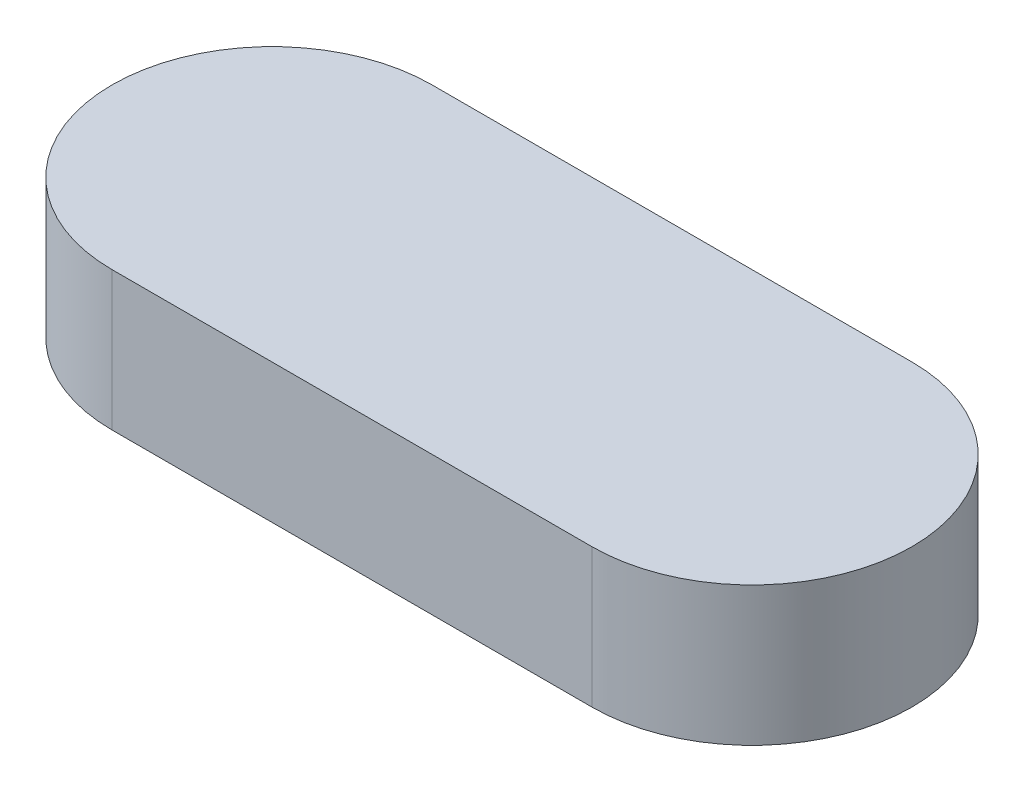
ISO-10303-21;
HEADER;
FILE_DESCRIPTION(('STEP AP214'),'2;1');
FILE_NAME('part.step','',(''),(''),'','','');
FILE_SCHEMA(('AUTOMOTIVE_DESIGN { 1 0 10303 214 1 1 1 1 }'));
ENDSEC;
DATA;
#1=APPLICATION_CONTEXT('core data for automotive mechanical design processes');
#2=APPLICATION_PROTOCOL_DEFINITION('international standard','automotive_design',2000,#1);
#3=PRODUCT_CONTEXT('',#1,'mechanical');
#4=PRODUCT('Part','Part','',(#3));
#5=PRODUCT_RELATED_PRODUCT_CATEGORY('part','',(#4));
#6=PRODUCT_DEFINITION_FORMATION('','',#4);
#7=PRODUCT_DEFINITION_CONTEXT('part definition',#1,'design');
#8=PRODUCT_DEFINITION('design','',#6,#7);
#9=PRODUCT_DEFINITION_SHAPE('','',#8);
#10=(LENGTH_UNIT() NAMED_UNIT(*) SI_UNIT(.MILLI.,.METRE.));
#11=(NAMED_UNIT(*) PLANE_ANGLE_UNIT() SI_UNIT($,.RADIAN.));
#12=(NAMED_UNIT(*) SI_UNIT($,.STERADIAN.) SOLID_ANGLE_UNIT());
#13=UNCERTAINTY_MEASURE_WITH_UNIT(LENGTH_MEASURE(1.E-05),#10,'distance_accuracy_value','');
#14=(GEOMETRIC_REPRESENTATION_CONTEXT(3) GLOBAL_UNCERTAINTY_ASSIGNED_CONTEXT((#13)) GLOBAL_UNIT_ASSIGNED_CONTEXT((#10,
#11,#12)) REPRESENTATION_CONTEXT('',''));
#15=CARTESIAN_POINT('',(0.,0.,0.));
#16=DIRECTION('',(0.,0.,1.));
#17=DIRECTION('',(1.,0.,0.));
#18=AXIS2_PLACEMENT_3D('',#15,#16,#17);
#19=CARTESIAN_POINT('',(9.,5.21,0.));
#20=DIRECTION('',(0.,-1.,0.));
#21=DIRECTION('',(0.,0.,-1.));
#22=AXIS2_PLACEMENT_3D('',#19,#20,#21);
#23=CYLINDRICAL_SURFACE('',#22,6.);
#24=CARTESIAN_POINT('',(9.,0.,0.));
#25=DIRECTION('',(0.,1.,0.));
#26=DIRECTION('',(0.,0.,1.));
#27=AXIS2_PLACEMENT_3D('',#24,#25,#26);
#28=CIRCLE('',#27,6.);
#29=CARTESIAN_POINT('',(9.,0.,6.));
#30=VERTEX_POINT('',#29);
#31=CARTESIAN_POINT('',(9.,0.,-6.));
#32=VERTEX_POINT('',#31);
#33=EDGE_CURVE('E102',#30,#32,#28,.T.);
#34=ORIENTED_EDGE('',*,*,#33,.T.);
#35=DIRECTION('',(0.,-1.,0.));
#36=VECTOR('',#35,1.);
#37=CARTESIAN_POINT('',(9.,5.21,-6.));
#38=LINE('',#37,#36);
#39=CARTESIAN_POINT('',(9.,5.21,-6.));
#40=VERTEX_POINT('',#39);
#41=EDGE_CURVE('E11',#40,#32,#38,.T.);
#42=ORIENTED_EDGE('',*,*,#41,.F.);
#43=CARTESIAN_POINT('',(9.,5.21,0.));
#44=DIRECTION('',(0.,1.,0.));
#45=DIRECTION('',(0.,0.,1.));
#46=AXIS2_PLACEMENT_3D('',#43,#44,#45);
#47=CIRCLE('',#46,6.);
#48=CARTESIAN_POINT('',(9.,5.21,6.));
#49=VERTEX_POINT('',#48);
#50=EDGE_CURVE('E90',#49,#40,#47,.T.);
#51=ORIENTED_EDGE('',*,*,#50,.F.);
#52=DIRECTION('',(0.,-1.,0.));
#53=VECTOR('',#52,1.);
#54=CARTESIAN_POINT('',(9.,5.21,6.));
#55=LINE('',#54,#53);
#56=EDGE_CURVE('E98',#49,#30,#55,.T.);
#57=ORIENTED_EDGE('',*,*,#56,.T.);
#58=EDGE_LOOP('',(#34,#42,#51,#57));
#59=FACE_BOUND('',#58,.T.);
#60=ADVANCED_FACE('F39',(#59),#23,.T.);
#61=CARTESIAN_POINT('',(9.,5.21,-6.));
#62=DIRECTION('',(0.,0.,1.));
#63=DIRECTION('',(1.,0.,0.));
#64=AXIS2_PLACEMENT_3D('',#61,#62,#63);
#65=PLANE('',#64);
#66=DIRECTION('',(-1.,0.,0.));
#67=VECTOR('',#66,1.);
#68=CARTESIAN_POINT('',(9.,0.,-6.));
#69=LINE('',#68,#67);
#70=CARTESIAN_POINT('',(-9.,0.,-6.));
#71=VERTEX_POINT('',#70);
#72=EDGE_CURVE('E94',#32,#71,#69,.T.);
#73=ORIENTED_EDGE('',*,*,#72,.T.);
#74=DIRECTION('',(0.,-1.,0.));
#75=VECTOR('',#74,1.);
#76=CARTESIAN_POINT('',(-9.,5.21,-6.));
#77=LINE('',#76,#75);
#78=CARTESIAN_POINT('',(-9.,5.21,-6.));
#79=VERTEX_POINT('',#78);
#80=EDGE_CURVE('E47',#79,#71,#77,.T.);
#81=ORIENTED_EDGE('',*,*,#80,.F.);
#82=DIRECTION('',(-1.,0.,0.));
#83=VECTOR('',#82,1.);
#84=CARTESIAN_POINT('',(9.,5.21,-6.));
#85=LINE('',#84,#83);
#86=EDGE_CURVE('E85',#40,#79,#85,.T.);
#87=ORIENTED_EDGE('',*,*,#86,.F.);
#88=ORIENTED_EDGE('',*,*,#41,.T.);
#89=EDGE_LOOP('',(#73,#81,#87,#88));
#90=FACE_BOUND('',#89,.T.);
#91=ADVANCED_FACE('F93',(#90),#65,.F.);
#92=CARTESIAN_POINT('',(-9.,5.21,0.));
#93=DIRECTION('',(0.,-1.,0.));
#94=DIRECTION('',(0.,0.,-1.));
#95=AXIS2_PLACEMENT_3D('',#92,#93,#94);
#96=CYLINDRICAL_SURFACE('',#95,6.);
#97=CARTESIAN_POINT('',(-9.,0.,0.));
#98=DIRECTION('',(0.,1.,0.));
#99=DIRECTION('',(0.,0.,1.));
#100=AXIS2_PLACEMENT_3D('',#97,#98,#99);
#101=CIRCLE('',#100,6.);
#102=CARTESIAN_POINT('',(-9.,0.,6.));
#103=VERTEX_POINT('',#102);
#104=EDGE_CURVE('E72',#71,#103,#101,.T.);
#105=ORIENTED_EDGE('',*,*,#104,.T.);
#106=DIRECTION('',(0.,-1.,0.));
#107=VECTOR('',#106,1.);
#108=CARTESIAN_POINT('',(-9.,5.21,6.));
#109=LINE('',#108,#107);
#110=CARTESIAN_POINT('',(-9.,5.21,6.));
#111=VERTEX_POINT('',#110);
#112=EDGE_CURVE('E95',#111,#103,#109,.T.);
#113=ORIENTED_EDGE('',*,*,#112,.F.);
#114=CARTESIAN_POINT('',(-9.,5.21,0.));
#115=DIRECTION('',(0.,1.,0.));
#116=DIRECTION('',(0.,0.,1.));
#117=AXIS2_PLACEMENT_3D('',#114,#115,#116);
#118=CIRCLE('',#117,6.);
#119=EDGE_CURVE('E88',#79,#111,#118,.T.);
#120=ORIENTED_EDGE('',*,*,#119,.F.);
#121=ORIENTED_EDGE('',*,*,#80,.T.);
#122=EDGE_LOOP('',(#105,#113,#120,#121));
#123=FACE_BOUND('',#122,.T.);
#124=ADVANCED_FACE('F96',(#123),#96,.T.);
#125=CARTESIAN_POINT('',(9.,5.21,6.));
#126=DIRECTION('',(0.,0.,-1.));
#127=DIRECTION('',(-1.,0.,0.));
#128=AXIS2_PLACEMENT_3D('',#125,#126,#127);
#129=PLANE('',#128);
#130=DIRECTION('',(1.,0.,0.));
#131=VECTOR('',#130,1.);
#132=CARTESIAN_POINT('',(9.,0.,6.));
#133=LINE('',#132,#131);
#134=EDGE_CURVE('E78',#103,#30,#133,.T.);
#135=ORIENTED_EDGE('',*,*,#134,.T.);
#136=ORIENTED_EDGE('',*,*,#56,.F.);
#137=DIRECTION('',(1.,0.,0.));
#138=VECTOR('',#137,1.);
#139=CARTESIAN_POINT('',(9.,5.21,6.));
#140=LINE('',#139,#138);
#141=EDGE_CURVE('E55',#111,#49,#140,.T.);
#142=ORIENTED_EDGE('',*,*,#141,.F.);
#143=ORIENTED_EDGE('',*,*,#112,.T.);
#144=EDGE_LOOP('',(#135,#136,#142,#143));
#145=FACE_BOUND('',#144,.T.);
#146=ADVANCED_FACE('F109',(#145),#129,.F.);
#147=CARTESIAN_POINT('',(9.,5.21,0.));
#148=DIRECTION('',(0.,1.,0.));
#149=DIRECTION('',(0.,0.,1.));
#150=AXIS2_PLACEMENT_3D('',#147,#148,#149);
#151=PLANE('',#150);
#152=ORIENTED_EDGE('',*,*,#50,.T.);
#153=ORIENTED_EDGE('',*,*,#86,.T.);
#154=ORIENTED_EDGE('',*,*,#119,.T.);
#155=ORIENTED_EDGE('',*,*,#141,.T.);
#156=EDGE_LOOP('',(#152,#153,#154,#155));
#157=FACE_BOUND('',#156,.T.);
#158=ADVANCED_FACE('F86',(#157),#151,.T.);
#159=CARTESIAN_POINT('',(9.,0.,0.));
#160=DIRECTION('',(0.,1.,0.));
#161=DIRECTION('',(0.,0.,1.));
#162=AXIS2_PLACEMENT_3D('',#159,#160,#161);
#163=PLANE('',#162);
#164=ORIENTED_EDGE('',*,*,#33,.F.);
#165=ORIENTED_EDGE('',*,*,#134,.F.);
#166=ORIENTED_EDGE('',*,*,#104,.F.);
#167=ORIENTED_EDGE('',*,*,#72,.F.);
#168=EDGE_LOOP('',(#164,#165,#166,#167));
#169=FACE_BOUND('',#168,.T.);
#170=ADVANCED_FACE('F112',(#169),#163,.F.);
#171=CLOSED_SHELL('',(#60,#91,#124,#146,#158,#170));
#172=MANIFOLD_SOLID_BREP('B2',#171);
#173=ADVANCED_BREP_SHAPE_REPRESENTATION('',(#18,#172),#14);
#174=SHAPE_DEFINITION_REPRESENTATION(#9,#173);
ENDSEC;
END-ISO-10303-21;
